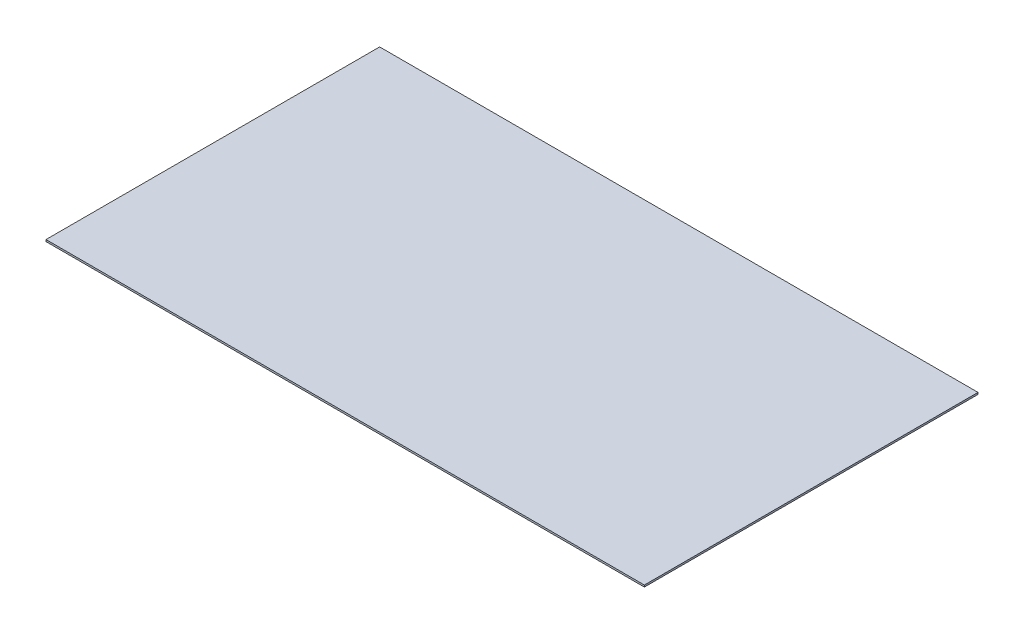
ISO-10303-21;
HEADER;
FILE_DESCRIPTION(('STEP AP214'),'2;1');
FILE_NAME('part.step','',(''),(''),'','','');
FILE_SCHEMA(('AUTOMOTIVE_DESIGN { 1 0 10303 214 1 1 1 1 }'));
ENDSEC;
DATA;
#1=APPLICATION_CONTEXT('core data for automotive mechanical design processes');
#2=APPLICATION_PROTOCOL_DEFINITION('international standard','automotive_design',2000,#1);
#3=PRODUCT_CONTEXT('',#1,'mechanical');
#4=PRODUCT('Part','Part','',(#3));
#5=PRODUCT_RELATED_PRODUCT_CATEGORY('part','',(#4));
#6=PRODUCT_DEFINITION_FORMATION('','',#4);
#7=PRODUCT_DEFINITION_CONTEXT('part definition',#1,'design');
#8=PRODUCT_DEFINITION('design','',#6,#7);
#9=PRODUCT_DEFINITION_SHAPE('','',#8);
#10=(LENGTH_UNIT() NAMED_UNIT(*) SI_UNIT(.MILLI.,.METRE.));
#11=(NAMED_UNIT(*) PLANE_ANGLE_UNIT() SI_UNIT($,.RADIAN.));
#12=(NAMED_UNIT(*) SI_UNIT($,.STERADIAN.) SOLID_ANGLE_UNIT());
#13=UNCERTAINTY_MEASURE_WITH_UNIT(LENGTH_MEASURE(1.E-05),#10,'distance_accuracy_value','');
#14=(GEOMETRIC_REPRESENTATION_CONTEXT(3) GLOBAL_UNCERTAINTY_ASSIGNED_CONTEXT((#13)) GLOBAL_UNIT_ASSIGNED_CONTEXT((#10,
#11,#12)) REPRESENTATION_CONTEXT('',''));
#15=CARTESIAN_POINT('',(0.,0.,0.));
#16=DIRECTION('',(0.,0.,1.));
#17=DIRECTION('',(1.,0.,0.));
#18=AXIS2_PLACEMENT_3D('',#15,#16,#17);
#19=CARTESIAN_POINT('',(0.,0.5,0.));
#20=DIRECTION('',(1.,0.,0.));
#21=DIRECTION('',(0.,0.,-1.));
#22=AXIS2_PLACEMENT_3D('',#19,#20,#21);
#23=PLANE('',#22);
#24=DIRECTION('',(0.,0.,1.));
#25=VECTOR('',#24,1.);
#26=CARTESIAN_POINT('',(0.,0.,0.));
#27=LINE('',#26,#25);
#28=CARTESIAN_POINT('',(0.,0.,-92.));
#29=VERTEX_POINT('',#28);
#30=CARTESIAN_POINT('',(0.,0.,0.));
#31=VERTEX_POINT('',#30);
#32=EDGE_CURVE('E100',#29,#31,#27,.T.);
#33=ORIENTED_EDGE('',*,*,#32,.T.);
#34=DIRECTION('',(0.,-1.,0.));
#35=VECTOR('',#34,1.);
#36=CARTESIAN_POINT('',(0.,0.5,0.));
#37=LINE('',#36,#35);
#38=CARTESIAN_POINT('',(0.,0.5,0.));
#39=VERTEX_POINT('',#38);
#40=EDGE_CURVE('E11',#39,#31,#37,.T.);
#41=ORIENTED_EDGE('',*,*,#40,.F.);
#42=DIRECTION('',(0.,0.,1.));
#43=VECTOR('',#42,1.);
#44=CARTESIAN_POINT('',(0.,0.5,0.));
#45=LINE('',#44,#43);
#46=CARTESIAN_POINT('',(0.,0.5,-92.));
#47=VERTEX_POINT('',#46);
#48=EDGE_CURVE('E88',#47,#39,#45,.T.);
#49=ORIENTED_EDGE('',*,*,#48,.F.);
#50=DIRECTION('',(0.,-1.,0.));
#51=VECTOR('',#50,1.);
#52=CARTESIAN_POINT('',(0.,0.5,-92.));
#53=LINE('',#52,#51);
#54=EDGE_CURVE('E96',#47,#29,#53,.T.);
#55=ORIENTED_EDGE('',*,*,#54,.T.);
#56=EDGE_LOOP('',(#33,#41,#49,#55));
#57=FACE_BOUND('',#56,.T.);
#58=ADVANCED_FACE('F37',(#57),#23,.F.);
#59=CARTESIAN_POINT('',(0.,0.5,0.));
#60=DIRECTION('',(0.,0.,-1.));
#61=DIRECTION('',(-1.,0.,0.));
#62=AXIS2_PLACEMENT_3D('',#59,#60,#61);
#63=PLANE('',#62);
#64=DIRECTION('',(1.,0.,0.));
#65=VECTOR('',#64,1.);
#66=CARTESIAN_POINT('',(0.,0.,0.));
#67=LINE('',#66,#65);
#68=CARTESIAN_POINT('',(165.,0.,0.));
#69=VERTEX_POINT('',#68);
#70=EDGE_CURVE('E92',#31,#69,#67,.T.);
#71=ORIENTED_EDGE('',*,*,#70,.T.);
#72=DIRECTION('',(0.,-1.,0.));
#73=VECTOR('',#72,1.);
#74=CARTESIAN_POINT('',(165.,0.5,0.));
#75=LINE('',#74,#73);
#76=CARTESIAN_POINT('',(165.,0.5,0.));
#77=VERTEX_POINT('',#76);
#78=EDGE_CURVE('E45',#77,#69,#75,.T.);
#79=ORIENTED_EDGE('',*,*,#78,.F.);
#80=DIRECTION('',(1.,0.,0.));
#81=VECTOR('',#80,1.);
#82=CARTESIAN_POINT('',(0.,0.5,0.));
#83=LINE('',#82,#81);
#84=EDGE_CURVE('E83',#39,#77,#83,.T.);
#85=ORIENTED_EDGE('',*,*,#84,.F.);
#86=ORIENTED_EDGE('',*,*,#40,.T.);
#87=EDGE_LOOP('',(#71,#79,#85,#86));
#88=FACE_BOUND('',#87,.T.);
#89=ADVANCED_FACE('F91',(#88),#63,.F.);
#90=CARTESIAN_POINT('',(165.,0.5,0.));
#91=DIRECTION('',(-1.,0.,0.));
#92=DIRECTION('',(0.,0.,1.));
#93=AXIS2_PLACEMENT_3D('',#90,#91,#92);
#94=PLANE('',#93);
#95=DIRECTION('',(0.,0.,-1.));
#96=VECTOR('',#95,1.);
#97=CARTESIAN_POINT('',(165.,0.,0.));
#98=LINE('',#97,#96);
#99=CARTESIAN_POINT('',(165.,0.,-92.));
#100=VERTEX_POINT('',#99);
#101=EDGE_CURVE('E70',#69,#100,#98,.T.);
#102=ORIENTED_EDGE('',*,*,#101,.T.);
#103=DIRECTION('',(0.,-1.,0.));
#104=VECTOR('',#103,1.);
#105=CARTESIAN_POINT('',(165.,0.5,-92.));
#106=LINE('',#105,#104);
#107=CARTESIAN_POINT('',(165.,0.5,-92.));
#108=VERTEX_POINT('',#107);
#109=EDGE_CURVE('E93',#108,#100,#106,.T.);
#110=ORIENTED_EDGE('',*,*,#109,.F.);
#111=DIRECTION('',(0.,0.,-1.));
#112=VECTOR('',#111,1.);
#113=CARTESIAN_POINT('',(165.,0.5,0.));
#114=LINE('',#113,#112);
#115=EDGE_CURVE('E86',#77,#108,#114,.T.);
#116=ORIENTED_EDGE('',*,*,#115,.F.);
#117=ORIENTED_EDGE('',*,*,#78,.T.);
#118=EDGE_LOOP('',(#102,#110,#116,#117));
#119=FACE_BOUND('',#118,.T.);
#120=ADVANCED_FACE('F94',(#119),#94,.F.);
#121=CARTESIAN_POINT('',(0.,0.5,-92.));
#122=DIRECTION('',(0.,0.,1.));
#123=DIRECTION('',(1.,0.,0.));
#124=AXIS2_PLACEMENT_3D('',#121,#122,#123);
#125=PLANE('',#124);
#126=DIRECTION('',(-1.,0.,0.));
#127=VECTOR('',#126,1.);
#128=CARTESIAN_POINT('',(0.,0.,-92.));
#129=LINE('',#128,#127);
#130=EDGE_CURVE('E76',#100,#29,#129,.T.);
#131=ORIENTED_EDGE('',*,*,#130,.T.);
#132=ORIENTED_EDGE('',*,*,#54,.F.);
#133=DIRECTION('',(-1.,0.,0.));
#134=VECTOR('',#133,1.);
#135=CARTESIAN_POINT('',(0.,0.5,-92.));
#136=LINE('',#135,#134);
#137=EDGE_CURVE('E53',#108,#47,#136,.T.);
#138=ORIENTED_EDGE('',*,*,#137,.F.);
#139=ORIENTED_EDGE('',*,*,#109,.T.);
#140=EDGE_LOOP('',(#131,#132,#138,#139));
#141=FACE_BOUND('',#140,.T.);
#142=ADVANCED_FACE('F107',(#141),#125,.F.);
#143=CARTESIAN_POINT('',(0.,0.5,0.));
#144=DIRECTION('',(0.,-1.,0.));
#145=DIRECTION('',(0.,0.,-1.));
#146=AXIS2_PLACEMENT_3D('',#143,#144,#145);
#147=PLANE('',#146);
#148=ORIENTED_EDGE('',*,*,#48,.T.);
#149=ORIENTED_EDGE('',*,*,#84,.T.);
#150=ORIENTED_EDGE('',*,*,#115,.T.);
#151=ORIENTED_EDGE('',*,*,#137,.T.);
#152=EDGE_LOOP('',(#148,#149,#150,#151));
#153=FACE_BOUND('',#152,.T.);
#154=ADVANCED_FACE('F84',(#153),#147,.F.);
#155=CARTESIAN_POINT('',(0.,0.,0.));
#156=DIRECTION('',(0.,-1.,0.));
#157=DIRECTION('',(0.,0.,-1.));
#158=AXIS2_PLACEMENT_3D('',#155,#156,#157);
#159=PLANE('',#158);
#160=ORIENTED_EDGE('',*,*,#32,.F.);
#161=ORIENTED_EDGE('',*,*,#130,.F.);
#162=ORIENTED_EDGE('',*,*,#101,.F.);
#163=ORIENTED_EDGE('',*,*,#70,.F.);
#164=EDGE_LOOP('',(#160,#161,#162,#163));
#165=FACE_BOUND('',#164,.T.);
#166=ADVANCED_FACE('F110',(#165),#159,.T.);
#167=CLOSED_SHELL('',(#58,#89,#120,#142,#154,#166));
#168=MANIFOLD_SOLID_BREP('B2',#167);
#169=ADVANCED_BREP_SHAPE_REPRESENTATION('',(#18,#168),#14);
#170=SHAPE_DEFINITION_REPRESENTATION(#9,#169);
ENDSEC;
END-ISO-10303-21;
